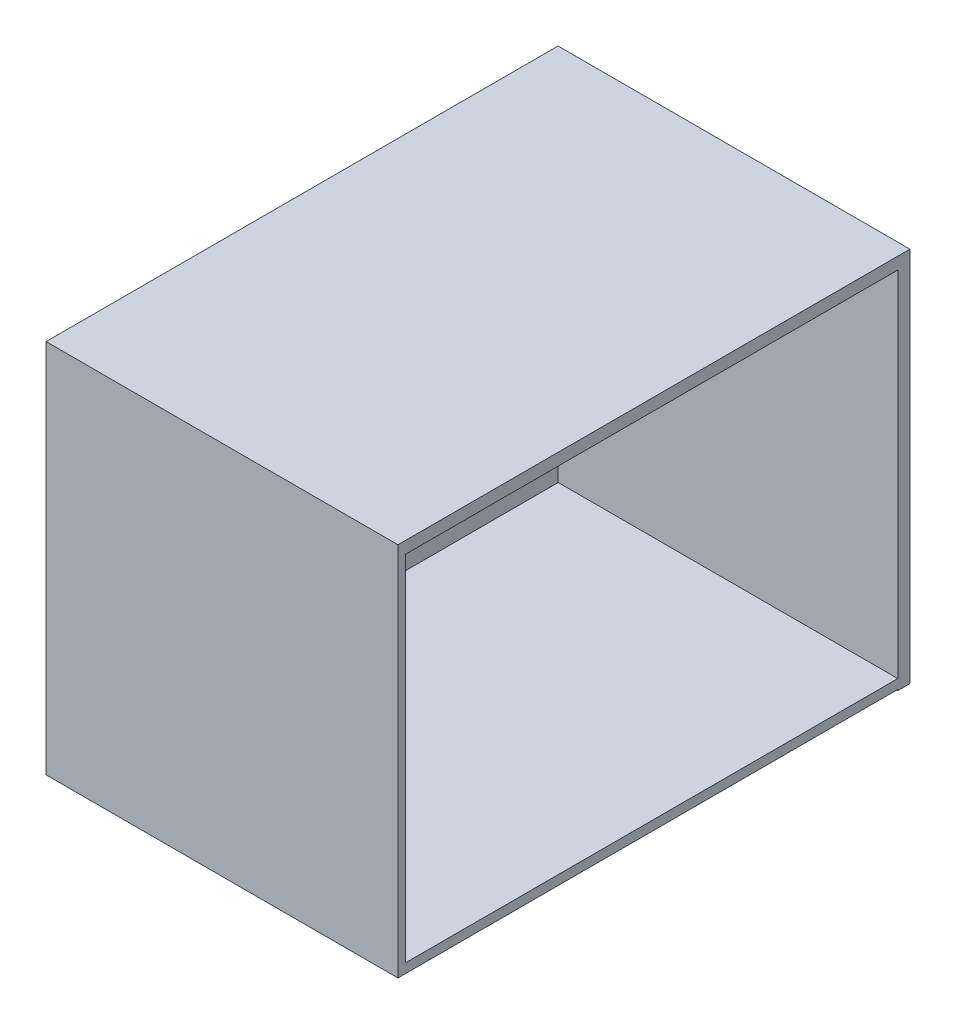
ISO-10303-21;
HEADER;
FILE_DESCRIPTION(('STEP AP214'),'2;1');
FILE_NAME('part.step','',(''),(''),'','','');
FILE_SCHEMA(('AUTOMOTIVE_DESIGN { 1 0 10303 214 1 1 1 1 }'));
ENDSEC;
DATA;
#1=APPLICATION_CONTEXT('core data for automotive mechanical design processes');
#2=APPLICATION_PROTOCOL_DEFINITION('international standard','automotive_design',2000,#1);
#3=PRODUCT_CONTEXT('',#1,'mechanical');
#4=PRODUCT('Part','Part','',(#3));
#5=PRODUCT_RELATED_PRODUCT_CATEGORY('part','',(#4));
#6=PRODUCT_DEFINITION_FORMATION('','',#4);
#7=PRODUCT_DEFINITION_CONTEXT('part definition',#1,'design');
#8=PRODUCT_DEFINITION('design','',#6,#7);
#9=PRODUCT_DEFINITION_SHAPE('','',#8);
#10=(LENGTH_UNIT() NAMED_UNIT(*) SI_UNIT(.MILLI.,.METRE.));
#11=(NAMED_UNIT(*) PLANE_ANGLE_UNIT() SI_UNIT($,.RADIAN.));
#12=(NAMED_UNIT(*) SI_UNIT($,.STERADIAN.) SOLID_ANGLE_UNIT());
#13=UNCERTAINTY_MEASURE_WITH_UNIT(LENGTH_MEASURE(1.E-05),#10,'distance_accuracy_value','');
#14=(GEOMETRIC_REPRESENTATION_CONTEXT(3) GLOBAL_UNCERTAINTY_ASSIGNED_CONTEXT((#13)) GLOBAL_UNIT_ASSIGNED_CONTEXT((#10,
#11,#12)) REPRESENTATION_CONTEXT('',''));
#15=CARTESIAN_POINT('',(0.,0.,0.));
#16=DIRECTION('',(0.,0.,1.));
#17=DIRECTION('',(1.,0.,0.));
#18=AXIS2_PLACEMENT_3D('',#15,#16,#17);
#19=CARTESIAN_POINT('',(2.,0.,0.));
#20=DIRECTION('',(1.,0.,0.));
#21=DIRECTION('',(0.,0.,-1.));
#22=AXIS2_PLACEMENT_3D('',#19,#20,#21);
#23=PLANE('',#22);
#24=DIRECTION('',(0.,-1.,0.));
#25=VECTOR('',#24,1.);
#26=CARTESIAN_POINT('',(2.,0.,98.15899887559));
#27=LINE('',#26,#25);
#28=CARTESIAN_POINT('',(2.,30.0428200792169,98.15899887559));
#29=VERTEX_POINT('',#28);
#30=CARTESIAN_POINT('',(2.,-0.559273207727524,98.15899887559));
#31=VERTEX_POINT('',#30);
#32=EDGE_CURVE('E175',#29,#31,#27,.T.);
#33=ORIENTED_EDGE('',*,*,#32,.F.);
#34=DIRECTION('',(0.,0.,1.));
#35=VECTOR('',#34,1.);
#36=CARTESIAN_POINT('',(2.,30.0428200792169,0.));
#37=LINE('',#36,#35);
#38=CARTESIAN_POINT('',(2.,30.0428200792169,56.6585640793278));
#39=VERTEX_POINT('',#38);
#40=EDGE_CURVE('E168',#39,#29,#37,.T.);
#41=ORIENTED_EDGE('',*,*,#40,.F.);
#42=DIRECTION('',(0.,1.,0.));
#43=VECTOR('',#42,1.);
#44=CARTESIAN_POINT('',(2.,0.,56.6585640793278));
#45=LINE('',#44,#43);
#46=CARTESIAN_POINT('',(2.,-0.559273207727524,56.6585640793278));
#47=VERTEX_POINT('',#46);
#48=EDGE_CURVE('E148',#47,#39,#45,.T.);
#49=ORIENTED_EDGE('',*,*,#48,.F.);
#50=DIRECTION('',(0.,0.,-1.));
#51=VECTOR('',#50,1.);
#52=CARTESIAN_POINT('',(2.,-0.559273207727524,0.));
#53=LINE('',#52,#51);
#54=EDGE_CURVE('E173',#31,#47,#53,.T.);
#55=ORIENTED_EDGE('',*,*,#54,.F.);
#56=EDGE_LOOP('',(#33,#41,#49,#55));
#57=FACE_BOUND('',#56,.T.);
#58=DIRECTION('',(0.,0.,1.));
#59=VECTOR('',#58,1.);
#60=CARTESIAN_POINT('',(2.,-7.75802853354126,109.113300223872));
#61=LINE('',#60,#59);
#62=CARTESIAN_POINT('',(2.,-7.75802853354126,28.1535638684005));
#63=VERTEX_POINT('',#62);
#64=CARTESIAN_POINT('',(2.,-7.75802853354126,107.875036718042));
#65=VERTEX_POINT('',#64);
#66=EDGE_CURVE('E215',#63,#65,#61,.T.);
#67=ORIENTED_EDGE('',*,*,#66,.F.);
#68=DIRECTION('',(0.,1.,0.));
#69=VECTOR('',#68,1.);
#70=CARTESIAN_POINT('',(2.,-9.44894712941511,28.1535638684005));
#71=LINE('',#70,#69);
#72=CARTESIAN_POINT('',(2.,49.5510528705849,28.1535638684005));
#73=VERTEX_POINT('',#72);
#74=EDGE_CURVE('E191',#63,#73,#71,.T.);
#75=ORIENTED_EDGE('',*,*,#74,.T.);
#76=DIRECTION('',(0.,0.,-1.));
#77=VECTOR('',#76,1.);
#78=CARTESIAN_POINT('',(2.,49.5510528705849,109.113300223872));
#79=LINE('',#78,#77);
#80=CARTESIAN_POINT('',(2.,49.5510528705849,107.875036718042));
#81=VERTEX_POINT('',#80);
#82=EDGE_CURVE('E221',#81,#73,#79,.T.);
#83=ORIENTED_EDGE('',*,*,#82,.F.);
#84=DIRECTION('',(0.,1.,0.));
#85=VECTOR('',#84,1.);
#86=CARTESIAN_POINT('',(2.,49.5510528705849,107.875036718042));
#87=LINE('',#86,#85);
#88=EDGE_CURVE('E205',#65,#81,#87,.T.);
#89=ORIENTED_EDGE('',*,*,#88,.F.);
#90=EDGE_LOOP('',(#67,#75,#83,#89));
#91=FACE_BOUND('',#90,.T.);
#92=ADVANCED_FACE('F35',(#57,#91),#23,.T.);
#93=CARTESIAN_POINT('',(57.,49.5510528705849,109.113300223872));
#94=DIRECTION('',(0.,1.,0.));
#95=DIRECTION('',(0.,0.,1.));
#96=AXIS2_PLACEMENT_3D('',#93,#94,#95);
#97=PLANE('',#96);
#98=DIRECTION('',(-1.,0.,0.));
#99=VECTOR('',#98,1.);
#100=CARTESIAN_POINT('',(57.,49.5510528705849,28.1535638684005));
#101=LINE('',#100,#99);
#102=CARTESIAN_POINT('',(57.,49.5510528705849,28.1535638684005));
#103=VERTEX_POINT('',#102);
#104=EDGE_CURVE('E177',#103,#73,#101,.T.);
#105=ORIENTED_EDGE('',*,*,#104,.F.);
#106=DIRECTION('',(0.,0.,-1.));
#107=VECTOR('',#106,1.);
#108=CARTESIAN_POINT('',(57.,49.5510528705849,109.113300223872));
#109=LINE('',#108,#107);
#110=CARTESIAN_POINT('',(57.,49.5510528705849,107.875036718042));
#111=VERTEX_POINT('',#110);
#112=EDGE_CURVE('E225',#111,#103,#109,.T.);
#113=ORIENTED_EDGE('',*,*,#112,.F.);
#114=DIRECTION('',(-1.,0.,0.));
#115=VECTOR('',#114,1.);
#116=CARTESIAN_POINT('',(57.,49.5510528705849,107.875036718042));
#117=LINE('',#116,#115);
#118=EDGE_CURVE('E208',#111,#81,#117,.T.);
#119=ORIENTED_EDGE('',*,*,#118,.T.);
#120=ORIENTED_EDGE('',*,*,#82,.T.);
#121=EDGE_LOOP('',(#105,#113,#119,#120));
#122=FACE_BOUND('',#121,.T.);
#123=ADVANCED_FACE('F297',(#122),#97,.F.);
#124=CARTESIAN_POINT('',(57.,-7.75802853354126,109.113300223872));
#125=DIRECTION('',(0.,-1.,0.));
#126=DIRECTION('',(0.,0.,-1.));
#127=AXIS2_PLACEMENT_3D('',#124,#125,#126);
#128=PLANE('',#127);
#129=DIRECTION('',(1.,0.,0.));
#130=VECTOR('',#129,1.);
#131=CARTESIAN_POINT('',(57.,-7.75802853354126,28.1535638684005));
#132=LINE('',#131,#130);
#133=CARTESIAN_POINT('',(57.,-7.75802853354126,28.1535638684005));
#134=VERTEX_POINT('',#133);
#135=EDGE_CURVE('E200',#63,#134,#132,.T.);
#136=ORIENTED_EDGE('',*,*,#135,.F.);
#137=ORIENTED_EDGE('',*,*,#66,.T.);
#138=DIRECTION('',(-1.,0.,0.));
#139=VECTOR('',#138,1.);
#140=CARTESIAN_POINT('',(57.,-7.75802853354126,107.875036718042));
#141=LINE('',#140,#139);
#142=CARTESIAN_POINT('',(57.,-7.75802853354126,107.875036718042));
#143=VERTEX_POINT('',#142);
#144=EDGE_CURVE('E212',#143,#65,#141,.T.);
#145=ORIENTED_EDGE('',*,*,#144,.F.);
#146=DIRECTION('',(0.,0.,1.));
#147=VECTOR('',#146,1.);
#148=CARTESIAN_POINT('',(57.,-7.75802853354126,109.113300223872));
#149=LINE('',#148,#147);
#150=EDGE_CURVE('E219',#134,#143,#149,.T.);
#151=ORIENTED_EDGE('',*,*,#150,.F.);
#152=EDGE_LOOP('',(#136,#137,#145,#151));
#153=FACE_BOUND('',#152,.T.);
#154=ADVANCED_FACE('F303',(#153),#128,.F.);
#155=CARTESIAN_POINT('',(2.,-9.28086580399547,109.113300223872));
#156=DIRECTION('',(0.,1.,0.));
#157=DIRECTION('',(0.,0.,1.));
#158=AXIS2_PLACEMENT_3D('',#155,#156,#157);
#159=PLANE('',#158);
#160=DIRECTION('',(-1.,0.,0.));
#161=VECTOR('',#160,1.);
#162=CARTESIAN_POINT('',(2.,-9.28086580399547,28.1535638684005));
#163=LINE('',#162,#161);
#164=CARTESIAN_POINT('',(57.,-9.28086580399547,28.1535638684005));
#165=VERTEX_POINT('',#164);
#166=CARTESIAN_POINT('',(2.,-9.28086580399547,28.1535638684005));
#167=VERTEX_POINT('',#166);
#168=EDGE_CURVE('E198',#165,#167,#163,.T.);
#169=ORIENTED_EDGE('',*,*,#168,.F.);
#170=DIRECTION('',(0.,0.,-1.));
#171=VECTOR('',#170,1.);
#172=CARTESIAN_POINT('',(57.,-9.28086580399547,109.113300223872));
#173=LINE('',#172,#171);
#174=CARTESIAN_POINT('',(57.,-9.28086580399547,109.113300223872));
#175=VERTEX_POINT('',#174);
#176=EDGE_CURVE('E216',#175,#165,#173,.T.);
#177=ORIENTED_EDGE('',*,*,#176,.F.);
#178=DIRECTION('',(-1.,0.,0.));
#179=VECTOR('',#178,1.);
#180=CARTESIAN_POINT('',(2.,-9.28086580399547,109.113300223872));
#181=LINE('',#180,#179);
#182=CARTESIAN_POINT('',(0.,-9.28086580399547,109.113300223872));
#183=VERTEX_POINT('',#182);
#184=EDGE_CURVE('E11',#175,#183,#181,.T.);
#185=ORIENTED_EDGE('',*,*,#184,.T.);
#186=DIRECTION('',(0.,0.,-1.));
#187=VECTOR('',#186,1.);
#188=CARTESIAN_POINT('',(0.,-9.28086580399547,109.113300223872));
#189=LINE('',#188,#187);
#190=CARTESIAN_POINT('',(0.,-9.28086580399547,26.185316221602));
#191=VERTEX_POINT('',#190);
#192=EDGE_CURVE('E239',#183,#191,#189,.T.);
#193=ORIENTED_EDGE('',*,*,#192,.T.);
#194=DIRECTION('',(-1.,0.,0.));
#195=VECTOR('',#194,1.);
#196=CARTESIAN_POINT('',(2.,-9.28086580399547,26.185316221602));
#197=LINE('',#196,#195);
#198=CARTESIAN_POINT('',(2.,-9.28086580399547,26.185316221602));
#199=VERTEX_POINT('',#198);
#200=EDGE_CURVE('E43',#199,#191,#197,.T.);
#201=ORIENTED_EDGE('',*,*,#200,.F.);
#202=DIRECTION('',(0.,0.,-1.));
#203=VECTOR('',#202,1.);
#204=CARTESIAN_POINT('',(2.,-9.28086580399547,109.113300223872));
#205=LINE('',#204,#203);
#206=EDGE_CURVE('E202',#167,#199,#205,.T.);
#207=ORIENTED_EDGE('',*,*,#206,.F.);
#208=EDGE_LOOP('',(#169,#177,#185,#193,#201,#207));
#209=FACE_BOUND('',#208,.T.);
#210=ADVANCED_FACE('F260',(#209),#159,.F.);
#211=CARTESIAN_POINT('',(2.,51.4955968520772,109.113300223872));
#212=DIRECTION('',(0.,0.,-1.));
#213=DIRECTION('',(-1.,0.,0.));
#214=AXIS2_PLACEMENT_3D('',#211,#212,#213);
#215=PLANE('',#214);
#216=DIRECTION('',(0.,-1.,0.));
#217=VECTOR('',#216,1.);
#218=CARTESIAN_POINT('',(0.,51.4955968520772,109.113300223872));
#219=LINE('',#218,#217);
#220=CARTESIAN_POINT('',(0.,51.4955968520772,109.113300223872));
#221=VERTEX_POINT('',#220);
#222=EDGE_CURVE('E234',#221,#183,#219,.T.);
#223=ORIENTED_EDGE('',*,*,#222,.T.);
#224=ORIENTED_EDGE('',*,*,#184,.F.);
#225=DIRECTION('',(0.,-1.,0.));
#226=VECTOR('',#225,1.);
#227=CARTESIAN_POINT('',(57.,51.4955968520772,109.113300223872));
#228=LINE('',#227,#226);
#229=CARTESIAN_POINT('',(57.,51.4955968520772,109.113300223872));
#230=VERTEX_POINT('',#229);
#231=EDGE_CURVE('E223',#230,#175,#228,.T.);
#232=ORIENTED_EDGE('',*,*,#231,.F.);
#233=DIRECTION('',(-1.,0.,0.));
#234=VECTOR('',#233,1.);
#235=CARTESIAN_POINT('',(2.,51.4955968520772,109.113300223872));
#236=LINE('',#235,#234);
#237=EDGE_CURVE('E246',#230,#221,#236,.T.);
#238=ORIENTED_EDGE('',*,*,#237,.T.);
#239=EDGE_LOOP('',(#223,#224,#232,#238));
#240=FACE_BOUND('',#239,.T.);
#241=ADVANCED_FACE('F37',(#240),#215,.F.);
#242=CARTESIAN_POINT('',(2.,51.4955968520772,26.1853162216021));
#243=DIRECTION('',(0.,0.,1.));
#244=DIRECTION('',(0.,-1.,0.));
#245=AXIS2_PLACEMENT_3D('',#242,#243,#244);
#246=PLANE('',#245);
#247=DIRECTION('',(0.,1.,0.));
#248=VECTOR('',#247,1.);
#249=CARTESIAN_POINT('',(57.,51.4955968520772,26.1853162216021));
#250=LINE('',#249,#248);
#251=CARTESIAN_POINT('',(57.,-9.44894712941511,26.1853162216021));
#252=VERTEX_POINT('',#251);
#253=CARTESIAN_POINT('',(57.,51.4955968520772,26.1853162216021));
#254=VERTEX_POINT('',#253);
#255=EDGE_CURVE('E228',#252,#254,#250,.T.);
#256=ORIENTED_EDGE('',*,*,#255,.F.);
#257=DIRECTION('',(1.,0.,0.));
#258=VECTOR('',#257,1.);
#259=CARTESIAN_POINT('',(57.,-9.44894712941511,26.1853162216021));
#260=LINE('',#259,#258);
#261=CARTESIAN_POINT('',(2.,-9.44894712941511,26.1853162216021));
#262=VERTEX_POINT('',#261);
#263=EDGE_CURVE('E185',#262,#252,#260,.T.);
#264=ORIENTED_EDGE('',*,*,#263,.F.);
#265=DIRECTION('',(0.,1.,0.));
#266=VECTOR('',#265,1.);
#267=CARTESIAN_POINT('',(2.,-9.44894712941511,26.1853162216021));
#268=LINE('',#267,#266);
#269=EDGE_CURVE('E188',#262,#199,#268,.T.);
#270=ORIENTED_EDGE('',*,*,#269,.T.);
#271=ORIENTED_EDGE('',*,*,#200,.T.);
#272=DIRECTION('',(0.,1.,0.));
#273=VECTOR('',#272,1.);
#274=CARTESIAN_POINT('',(0.,51.4955968520772,26.1853162216021));
#275=LINE('',#274,#273);
#276=CARTESIAN_POINT('',(0.,51.4955968520772,26.1853162216021));
#277=VERTEX_POINT('',#276);
#278=EDGE_CURVE('E242',#191,#277,#275,.T.);
#279=ORIENTED_EDGE('',*,*,#278,.T.);
#280=DIRECTION('',(-1.,0.,0.));
#281=VECTOR('',#280,1.);
#282=CARTESIAN_POINT('',(2.,51.4955968520772,26.1853162216021));
#283=LINE('',#282,#281);
#284=EDGE_CURVE('E249',#254,#277,#283,.T.);
#285=ORIENTED_EDGE('',*,*,#284,.F.);
#286=EDGE_LOOP('',(#256,#264,#270,#271,#279,#285));
#287=FACE_BOUND('',#286,.T.);
#288=ADVANCED_FACE('F253',(#287),#246,.F.);
#289=CARTESIAN_POINT('',(2.,51.4955968520772,109.113300223872));
#290=DIRECTION('',(0.,-1.,0.));
#291=DIRECTION('',(0.,0.,-1.));
#292=AXIS2_PLACEMENT_3D('',#289,#290,#291);
#293=PLANE('',#292);
#294=DIRECTION('',(0.,0.,1.));
#295=VECTOR('',#294,1.);
#296=CARTESIAN_POINT('',(0.,51.4955968520772,109.113300223872));
#297=LINE('',#296,#295);
#298=EDGE_CURVE('E244',#277,#221,#297,.T.);
#299=ORIENTED_EDGE('',*,*,#298,.T.);
#300=ORIENTED_EDGE('',*,*,#237,.F.);
#301=DIRECTION('',(0.,0.,1.));
#302=VECTOR('',#301,1.);
#303=CARTESIAN_POINT('',(57.,51.4955968520772,109.113300223872));
#304=LINE('',#303,#302);
#305=EDGE_CURVE('E231',#254,#230,#304,.T.);
#306=ORIENTED_EDGE('',*,*,#305,.F.);
#307=ORIENTED_EDGE('',*,*,#284,.T.);
#308=EDGE_LOOP('',(#299,#300,#306,#307));
#309=FACE_BOUND('',#308,.T.);
#310=ADVANCED_FACE('F266',(#309),#293,.F.);
#311=CARTESIAN_POINT('',(0.,0.,0.));
#312=DIRECTION('',(1.,0.,0.));
#313=DIRECTION('',(0.,0.,-1.));
#314=AXIS2_PLACEMENT_3D('',#311,#312,#313);
#315=PLANE('',#314);
#316=DIRECTION('',(0.,0.,-1.));
#317=VECTOR('',#316,1.);
#318=CARTESIAN_POINT('',(0.,30.0428200792169,98.15899887559));
#319=LINE('',#318,#317);
#320=CARTESIAN_POINT('',(0.,30.0428200792169,98.15899887559));
#321=VERTEX_POINT('',#320);
#322=CARTESIAN_POINT('',(0.,30.0428200792169,56.6585640793278));
#323=VERTEX_POINT('',#322);
#324=EDGE_CURVE('E154',#321,#323,#319,.T.);
#325=ORIENTED_EDGE('',*,*,#324,.F.);
#326=DIRECTION('',(0.,1.,0.));
#327=VECTOR('',#326,1.);
#328=CARTESIAN_POINT('',(0.,-0.559273207727524,98.15899887559));
#329=LINE('',#328,#327);
#330=CARTESIAN_POINT('',(0.,-0.559273207727524,98.15899887559));
#331=VERTEX_POINT('',#330);
#332=EDGE_CURVE('E58',#331,#321,#329,.T.);
#333=ORIENTED_EDGE('',*,*,#332,.F.);
#334=DIRECTION('',(0.,0.,1.));
#335=VECTOR('',#334,1.);
#336=CARTESIAN_POINT('',(0.,-0.559273207727524,98.15899887559));
#337=LINE('',#336,#335);
#338=CARTESIAN_POINT('',(0.,-0.559273207727524,56.6585640793278));
#339=VERTEX_POINT('',#338);
#340=EDGE_CURVE('E161',#339,#331,#337,.T.);
#341=ORIENTED_EDGE('',*,*,#340,.F.);
#342=DIRECTION('',(0.,-1.,0.));
#343=VECTOR('',#342,1.);
#344=CARTESIAN_POINT('',(0.,-0.559273207727524,56.6585640793278));
#345=LINE('',#344,#343);
#346=EDGE_CURVE('E145',#323,#339,#345,.T.);
#347=ORIENTED_EDGE('',*,*,#346,.F.);
#348=EDGE_LOOP('',(#325,#333,#341,#347));
#349=FACE_BOUND('',#348,.T.);
#350=ORIENTED_EDGE('',*,*,#222,.F.);
#351=ORIENTED_EDGE('',*,*,#298,.F.);
#352=ORIENTED_EDGE('',*,*,#278,.F.);
#353=ORIENTED_EDGE('',*,*,#192,.F.);
#354=EDGE_LOOP('',(#350,#351,#352,#353));
#355=FACE_BOUND('',#354,.T.);
#356=ADVANCED_FACE('F158',(#349,#355),#315,.F.);
#357=CARTESIAN_POINT('',(57.,0.,0.));
#358=DIRECTION('',(1.,0.,0.));
#359=DIRECTION('',(0.,0.,-1.));
#360=AXIS2_PLACEMENT_3D('',#357,#358,#359);
#361=PLANE('',#360);
#362=DIRECTION('',(0.,1.,0.));
#363=VECTOR('',#362,1.);
#364=CARTESIAN_POINT('',(57.,-9.44894712941511,28.1535638684005));
#365=LINE('',#364,#363);
#366=EDGE_CURVE('E195',#134,#103,#365,.T.);
#367=ORIENTED_EDGE('',*,*,#366,.F.);
#368=ORIENTED_EDGE('',*,*,#150,.T.);
#369=DIRECTION('',(0.,1.,0.));
#370=VECTOR('',#369,1.);
#371=CARTESIAN_POINT('',(57.,49.5510528705849,107.875036718042));
#372=LINE('',#371,#370);
#373=EDGE_CURVE('E206',#143,#111,#372,.T.);
#374=ORIENTED_EDGE('',*,*,#373,.T.);
#375=ORIENTED_EDGE('',*,*,#112,.T.);
#376=EDGE_LOOP('',(#367,#368,#374,#375));
#377=FACE_BOUND('',#376,.T.);
#378=DIRECTION('',(0.,0.,1.));
#379=VECTOR('',#378,1.);
#380=CARTESIAN_POINT('',(57.,-9.44894712941511,26.1853162216021));
#381=LINE('',#380,#379);
#382=CARTESIAN_POINT('',(57.,-9.44894712941511,28.1535638684005));
#383=VERTEX_POINT('',#382);
#384=EDGE_CURVE('E178',#252,#383,#381,.T.);
#385=ORIENTED_EDGE('',*,*,#384,.F.);
#386=ORIENTED_EDGE('',*,*,#255,.T.);
#387=ORIENTED_EDGE('',*,*,#305,.T.);
#388=ORIENTED_EDGE('',*,*,#231,.T.);
#389=ORIENTED_EDGE('',*,*,#176,.T.);
#390=EDGE_CURVE('E196',#383,#165,#365,.T.);
#391=ORIENTED_EDGE('',*,*,#390,.F.);
#392=EDGE_LOOP('',(#385,#386,#387,#388,#389,#391));
#393=FACE_BOUND('',#392,.T.);
#394=ADVANCED_FACE('F272',(#377,#393),#361,.T.);
#395=CARTESIAN_POINT('',(57.,49.5510528705849,107.875036718042));
#396=DIRECTION('',(0.,0.,1.));
#397=DIRECTION('',(1.,0.,0.));
#398=AXIS2_PLACEMENT_3D('',#395,#396,#397);
#399=PLANE('',#398);
#400=ORIENTED_EDGE('',*,*,#88,.T.);
#401=ORIENTED_EDGE('',*,*,#118,.F.);
#402=ORIENTED_EDGE('',*,*,#373,.F.);
#403=ORIENTED_EDGE('',*,*,#144,.T.);
#404=EDGE_LOOP('',(#400,#401,#402,#403));
#405=FACE_BOUND('',#404,.T.);
#406=ADVANCED_FACE('F294',(#405),#399,.F.);
#407=CARTESIAN_POINT('',(57.,-9.44894712941511,28.1535638684005));
#408=DIRECTION('',(0.,0.,-1.));
#409=DIRECTION('',(-1.,0.,0.));
#410=AXIS2_PLACEMENT_3D('',#407,#408,#409);
#411=PLANE('',#410);
#412=ORIENTED_EDGE('',*,*,#74,.F.);
#413=ORIENTED_EDGE('',*,*,#135,.T.);
#414=ORIENTED_EDGE('',*,*,#366,.T.);
#415=ORIENTED_EDGE('',*,*,#104,.T.);
#416=EDGE_LOOP('',(#412,#413,#414,#415));
#417=FACE_BOUND('',#416,.T.);
#418=ADVANCED_FACE('F284',(#417),#411,.F.);
#419=CARTESIAN_POINT('',(2.,-9.44894712941511,26.1853162216021));
#420=DIRECTION('',(1.,0.,0.));
#421=DIRECTION('',(0.,0.,-1.));
#422=AXIS2_PLACEMENT_3D('',#419,#420,#421);
#423=PLANE('',#422);
#424=CARTESIAN_POINT('',(2.,-9.44894712941511,28.1535638684005));
#425=VERTEX_POINT('',#424);
#426=EDGE_CURVE('E192',#425,#167,#71,.T.);
#427=ORIENTED_EDGE('',*,*,#426,.T.);
#428=ORIENTED_EDGE('',*,*,#206,.T.);
#429=ORIENTED_EDGE('',*,*,#269,.F.);
#430=DIRECTION('',(0.,0.,-1.));
#431=VECTOR('',#430,1.);
#432=CARTESIAN_POINT('',(2.,-9.44894712941511,26.1853162216021));
#433=LINE('',#432,#431);
#434=EDGE_CURVE('E183',#425,#262,#433,.T.);
#435=ORIENTED_EDGE('',*,*,#434,.F.);
#436=EDGE_LOOP('',(#427,#428,#429,#435));
#437=FACE_BOUND('',#436,.T.);
#438=ADVANCED_FACE('F279',(#437),#423,.F.);
#439=ORIENTED_EDGE('',*,*,#390,.T.);
#440=ORIENTED_EDGE('',*,*,#168,.T.);
#441=ORIENTED_EDGE('',*,*,#426,.F.);
#442=DIRECTION('',(-1.,0.,0.));
#443=VECTOR('',#442,1.);
#444=CARTESIAN_POINT('',(57.,-9.44894712941511,28.1535638684005));
#445=LINE('',#444,#443);
#446=EDGE_CURVE('E181',#383,#425,#445,.T.);
#447=ORIENTED_EDGE('',*,*,#446,.F.);
#448=EDGE_LOOP('',(#439,#440,#441,#447));
#449=FACE_BOUND('',#448,.T.);
#450=ADVANCED_FACE('F281',(#449),#411,.F.);
#451=CARTESIAN_POINT('',(0.,-9.44894712941511,0.));
#452=DIRECTION('',(0.,-1.,0.));
#453=DIRECTION('',(0.,0.,-1.));
#454=AXIS2_PLACEMENT_3D('',#451,#452,#453);
#455=PLANE('',#454);
#456=ORIENTED_EDGE('',*,*,#384,.T.);
#457=ORIENTED_EDGE('',*,*,#446,.T.);
#458=ORIENTED_EDGE('',*,*,#434,.T.);
#459=ORIENTED_EDGE('',*,*,#263,.T.);
#460=EDGE_LOOP('',(#456,#457,#458,#459));
#461=FACE_BOUND('',#460,.T.);
#462=ADVANCED_FACE('F275',(#461),#455,.T.);
#463=CARTESIAN_POINT('',(59.,-0.559273207727524,98.15899887559));
#464=DIRECTION('',(0.,0.,1.));
#465=DIRECTION('',(1.,0.,0.));
#466=AXIS2_PLACEMENT_3D('',#463,#464,#465);
#467=PLANE('',#466);
#468=ORIENTED_EDGE('',*,*,#32,.T.);
#469=DIRECTION('',(-1.,0.,0.));
#470=VECTOR('',#469,1.);
#471=CARTESIAN_POINT('',(59.,-0.559273207727524,98.15899887559));
#472=LINE('',#471,#470);
#473=EDGE_CURVE('E166',#31,#331,#472,.T.);
#474=ORIENTED_EDGE('',*,*,#473,.T.);
#475=ORIENTED_EDGE('',*,*,#332,.T.);
#476=DIRECTION('',(-1.,0.,0.));
#477=VECTOR('',#476,1.);
#478=CARTESIAN_POINT('',(59.,30.0428200792169,98.15899887559));
#479=LINE('',#478,#477);
#480=EDGE_CURVE('E151',#29,#321,#479,.T.);
#481=ORIENTED_EDGE('',*,*,#480,.F.);
#482=EDGE_LOOP('',(#468,#474,#475,#481));
#483=FACE_BOUND('',#482,.T.);
#484=ADVANCED_FACE('F289',(#483),#467,.F.);
#485=CARTESIAN_POINT('',(59.,-0.559273207727524,98.15899887559));
#486=DIRECTION('',(0.,-1.,0.));
#487=DIRECTION('',(0.,0.,-1.));
#488=AXIS2_PLACEMENT_3D('',#485,#486,#487);
#489=PLANE('',#488);
#490=ORIENTED_EDGE('',*,*,#54,.T.);
#491=DIRECTION('',(-1.,0.,0.));
#492=VECTOR('',#491,1.);
#493=CARTESIAN_POINT('',(59.,-0.559273207727524,56.6585640793278));
#494=LINE('',#493,#492);
#495=EDGE_CURVE('E150',#47,#339,#494,.T.);
#496=ORIENTED_EDGE('',*,*,#495,.T.);
#497=ORIENTED_EDGE('',*,*,#340,.T.);
#498=ORIENTED_EDGE('',*,*,#473,.F.);
#499=EDGE_LOOP('',(#490,#496,#497,#498));
#500=FACE_BOUND('',#499,.T.);
#501=ADVANCED_FACE('F388',(#500),#489,.F.);
#502=CARTESIAN_POINT('',(59.,-0.559273207727524,56.6585640793278));
#503=DIRECTION('',(0.,0.,-1.));
#504=DIRECTION('',(-1.,0.,0.));
#505=AXIS2_PLACEMENT_3D('',#502,#503,#504);
#506=PLANE('',#505);
#507=ORIENTED_EDGE('',*,*,#48,.T.);
#508=DIRECTION('',(-1.,0.,0.));
#509=VECTOR('',#508,1.);
#510=CARTESIAN_POINT('',(59.,30.0428200792169,56.6585640793278));
#511=LINE('',#510,#509);
#512=EDGE_CURVE('E50',#39,#323,#511,.T.);
#513=ORIENTED_EDGE('',*,*,#512,.T.);
#514=ORIENTED_EDGE('',*,*,#346,.T.);
#515=ORIENTED_EDGE('',*,*,#495,.F.);
#516=EDGE_LOOP('',(#507,#513,#514,#515));
#517=FACE_BOUND('',#516,.T.);
#518=ADVANCED_FACE('F142',(#517),#506,.F.);
#519=CARTESIAN_POINT('',(59.,30.0428200792169,98.15899887559));
#520=DIRECTION('',(0.,1.,0.));
#521=DIRECTION('',(0.,0.,1.));
#522=AXIS2_PLACEMENT_3D('',#519,#520,#521);
#523=PLANE('',#522);
#524=ORIENTED_EDGE('',*,*,#40,.T.);
#525=ORIENTED_EDGE('',*,*,#480,.T.);
#526=ORIENTED_EDGE('',*,*,#324,.T.);
#527=ORIENTED_EDGE('',*,*,#512,.F.);
#528=EDGE_LOOP('',(#524,#525,#526,#527));
#529=FACE_BOUND('',#528,.T.);
#530=ADVANCED_FACE('F155',(#529),#523,.F.);
#531=CLOSED_SHELL('',(#92,#123,#154,#210,#241,#288,#310,#356,#394,#406,#418,#438,#450,#462,#484,
#501,#518,#530));
#532=MANIFOLD_SOLID_BREP('B2',#531);
#533=ADVANCED_BREP_SHAPE_REPRESENTATION('',(#18,#532),#14);
#534=SHAPE_DEFINITION_REPRESENTATION(#9,#533);
ENDSEC;
END-ISO-10303-21;
